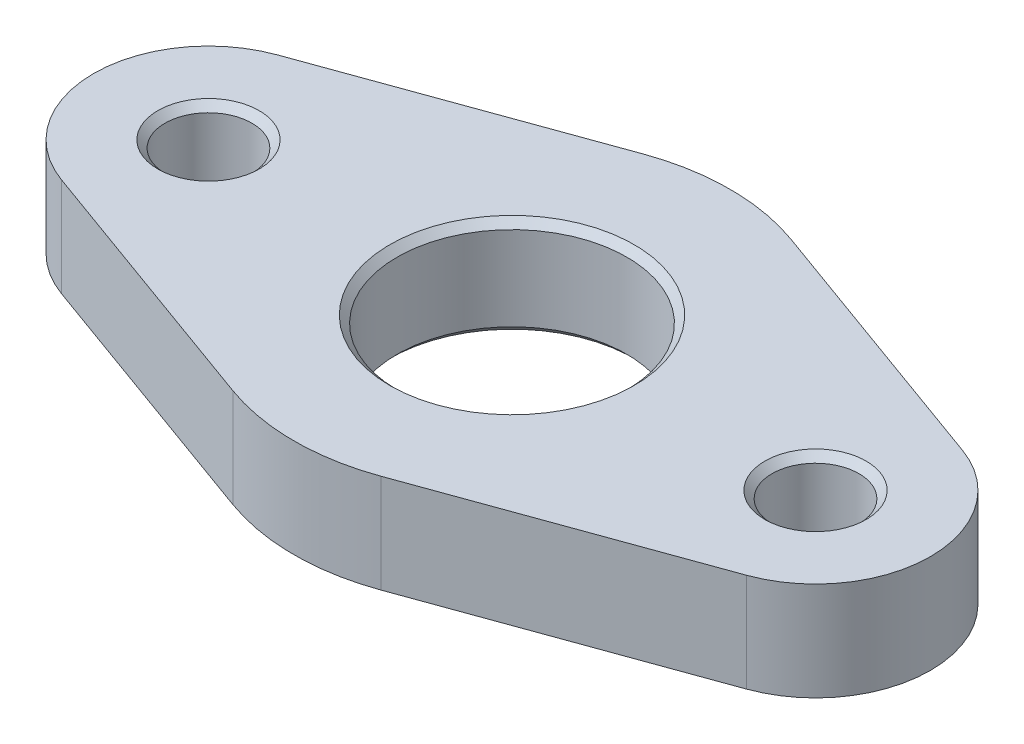
ISO-10303-21;
HEADER;
FILE_DESCRIPTION(('STEP AP214'),'2;1');
FILE_NAME('part.step','',(''),(''),'','','');
FILE_SCHEMA(('AUTOMOTIVE_DESIGN { 1 0 10303 214 1 1 1 1 }'));
ENDSEC;
DATA;
#1=APPLICATION_CONTEXT('core data for automotive mechanical design processes');
#2=APPLICATION_PROTOCOL_DEFINITION('international standard','automotive_design',2000,#1);
#3=PRODUCT_CONTEXT('',#1,'mechanical');
#4=PRODUCT('Part','Part','',(#3));
#5=PRODUCT_RELATED_PRODUCT_CATEGORY('part','',(#4));
#6=PRODUCT_DEFINITION_FORMATION('','',#4);
#7=PRODUCT_DEFINITION_CONTEXT('part definition',#1,'design');
#8=PRODUCT_DEFINITION('design','',#6,#7);
#9=PRODUCT_DEFINITION_SHAPE('','',#8);
#10=(LENGTH_UNIT() NAMED_UNIT(*) SI_UNIT(.MILLI.,.METRE.));
#11=(NAMED_UNIT(*) PLANE_ANGLE_UNIT() SI_UNIT($,.RADIAN.));
#12=(NAMED_UNIT(*) SI_UNIT($,.STERADIAN.) SOLID_ANGLE_UNIT());
#13=UNCERTAINTY_MEASURE_WITH_UNIT(LENGTH_MEASURE(1.E-05),#10,'distance_accuracy_value','');
#14=(GEOMETRIC_REPRESENTATION_CONTEXT(3) GLOBAL_UNCERTAINTY_ASSIGNED_CONTEXT((#13)) GLOBAL_UNIT_ASSIGNED_CONTEXT((#10,
#11,#12)) REPRESENTATION_CONTEXT('',''));
#15=CARTESIAN_POINT('',(0.,0.,0.));
#16=DIRECTION('',(0.,0.,1.));
#17=DIRECTION('',(1.,0.,0.));
#18=AXIS2_PLACEMENT_3D('',#15,#16,#17);
#19=CARTESIAN_POINT('',(-33.55,10.9,0.));
#20=DIRECTION('',(0.,-1.,0.));
#21=DIRECTION('',(0.,0.,-1.));
#22=AXIS2_PLACEMENT_3D('',#19,#20,#21);
#23=CYLINDRICAL_SURFACE('',#22,12.7);
#24=CARTESIAN_POINT('',(-33.55,0.,0.));
#25=DIRECTION('',(0.,1.,0.));
#26=DIRECTION('',(0.,0.,1.));
#27=AXIS2_PLACEMENT_3D('',#24,#25,#26);
#28=CIRCLE('',#27,12.7);
#29=CARTESIAN_POINT('',(-37.8653502235469,0.,-11.9443606965017));
#30=VERTEX_POINT('',#29);
#31=CARTESIAN_POINT('',(-37.8653502235469,0.,11.9443606965017));
#32=VERTEX_POINT('',#31);
#33=EDGE_CURVE('E153',#30,#32,#28,.T.);
#34=ORIENTED_EDGE('',*,*,#33,.T.);
#35=DIRECTION('',(0.,-1.,0.));
#36=VECTOR('',#35,1.);
#37=CARTESIAN_POINT('',(-37.8653502235469,10.9,11.9443606965017));
#38=LINE('',#37,#36);
#39=CARTESIAN_POINT('',(-37.8653502235469,10.9,11.9443606965017));
#40=VERTEX_POINT('',#39);
#41=EDGE_CURVE('E194',#40,#32,#38,.T.);
#42=ORIENTED_EDGE('',*,*,#41,.F.);
#43=CARTESIAN_POINT('',(-33.55,10.9,0.));
#44=DIRECTION('',(0.,1.,0.));
#45=DIRECTION('',(0.,0.,1.));
#46=AXIS2_PLACEMENT_3D('',#43,#44,#45);
#47=CIRCLE('',#46,12.7);
#48=CARTESIAN_POINT('',(-37.8653502235469,10.9,-11.9443606965017));
#49=VERTEX_POINT('',#48);
#50=EDGE_CURVE('E175',#49,#40,#47,.T.);
#51=ORIENTED_EDGE('',*,*,#50,.F.);
#52=DIRECTION('',(0.,-1.,0.));
#53=VECTOR('',#52,1.);
#54=CARTESIAN_POINT('',(-37.8653502235469,10.9,-11.9443606965017));
#55=LINE('',#54,#53);
#56=EDGE_CURVE('E149',#49,#30,#55,.T.);
#57=ORIENTED_EDGE('',*,*,#56,.T.);
#58=EDGE_LOOP('',(#34,#42,#51,#57));
#59=FACE_BOUND('',#58,.T.);
#60=ADVANCED_FACE('F49',(#59),#23,.T.);
#61=CARTESIAN_POINT('',(-37.8653502235469,10.9,11.9443606965017));
#62=DIRECTION('',(0.339791356184799,0.,-0.940500842244224));
#63=DIRECTION('',(-0.940500842244224,0.,-0.339791356184799));
#64=AXIS2_PLACEMENT_3D('',#61,#62,#63);
#65=PLANE('',#64);
#66=DIRECTION('',(0.940500842244224,0.,0.339791356184799));
#67=VECTOR('',#66,1.);
#68=CARTESIAN_POINT('',(-37.8653502235469,0.,11.9443606965017));
#69=LINE('',#68,#67);
#70=CARTESIAN_POINT('',(-8.18897168405365,0.,22.6660702980858));
#71=VERTEX_POINT('',#70);
#72=EDGE_CURVE('E157',#32,#71,#69,.T.);
#73=ORIENTED_EDGE('',*,*,#72,.T.);
#74=DIRECTION('',(0.,-1.,0.));
#75=VECTOR('',#74,1.);
#76=CARTESIAN_POINT('',(-8.18897168405365,10.9,22.6660702980858));
#77=LINE('',#76,#75);
#78=CARTESIAN_POINT('',(-8.18897168405365,10.9,22.6660702980858));
#79=VERTEX_POINT('',#78);
#80=EDGE_CURVE('E190',#79,#71,#77,.T.);
#81=ORIENTED_EDGE('',*,*,#80,.F.);
#82=DIRECTION('',(0.940500842244224,0.,0.339791356184799));
#83=VECTOR('',#82,1.);
#84=CARTESIAN_POINT('',(-37.8653502235469,10.9,11.9443606965017));
#85=LINE('',#84,#83);
#86=EDGE_CURVE('E112',#40,#79,#85,.T.);
#87=ORIENTED_EDGE('',*,*,#86,.F.);
#88=ORIENTED_EDGE('',*,*,#41,.T.);
#89=EDGE_LOOP('',(#73,#81,#87,#88));
#90=FACE_BOUND('',#89,.T.);
#91=ADVANCED_FACE('F272',(#90),#65,.F.);
#92=CARTESIAN_POINT('',(0.,10.9,0.));
#93=DIRECTION('',(0.,-1.,0.));
#94=DIRECTION('',(0.,0.,-1.));
#95=AXIS2_PLACEMENT_3D('',#92,#93,#94);
#96=CYLINDRICAL_SURFACE('',#95,24.1);
#97=CARTESIAN_POINT('',(0.,0.,0.));
#98=DIRECTION('',(0.,1.,0.));
#99=DIRECTION('',(0.,0.,1.));
#100=AXIS2_PLACEMENT_3D('',#97,#98,#99);
#101=CIRCLE('',#100,24.1);
#102=CARTESIAN_POINT('',(8.18897168405365,0.,22.6660702980858));
#103=VERTEX_POINT('',#102);
#104=EDGE_CURVE('E160',#71,#103,#101,.T.);
#105=ORIENTED_EDGE('',*,*,#104,.T.);
#106=DIRECTION('',(0.,-1.,0.));
#107=VECTOR('',#106,1.);
#108=CARTESIAN_POINT('',(8.18897168405365,10.9,22.6660702980858));
#109=LINE('',#108,#107);
#110=CARTESIAN_POINT('',(8.18897168405365,10.9,22.6660702980858));
#111=VERTEX_POINT('',#110);
#112=EDGE_CURVE('E186',#111,#103,#109,.T.);
#113=ORIENTED_EDGE('',*,*,#112,.F.);
#114=CARTESIAN_POINT('',(0.,10.9,0.));
#115=DIRECTION('',(0.,1.,0.));
#116=DIRECTION('',(0.,0.,1.));
#117=AXIS2_PLACEMENT_3D('',#114,#115,#116);
#118=CIRCLE('',#117,24.1);
#119=EDGE_CURVE('E466',#79,#111,#118,.T.);
#120=ORIENTED_EDGE('',*,*,#119,.F.);
#121=ORIENTED_EDGE('',*,*,#80,.T.);
#122=EDGE_LOOP('',(#105,#113,#120,#121));
#123=FACE_BOUND('',#122,.T.);
#124=ADVANCED_FACE('F277',(#123),#96,.T.);
#125=CARTESIAN_POINT('',(37.8653502235469,10.9,11.9443606965017));
#126=DIRECTION('',(-0.339791356184799,0.,-0.940500842244224));
#127=DIRECTION('',(-0.940500842244224,0.,0.339791356184799));
#128=AXIS2_PLACEMENT_3D('',#125,#126,#127);
#129=PLANE('',#128);
#130=DIRECTION('',(0.940500842244224,0.,-0.339791356184799));
#131=VECTOR('',#130,1.);
#132=CARTESIAN_POINT('',(37.8653502235469,0.,11.9443606965017));
#133=LINE('',#132,#131);
#134=CARTESIAN_POINT('',(37.8653502235469,0.,11.9443606965016));
#135=VERTEX_POINT('',#134);
#136=EDGE_CURVE('E163',#103,#135,#133,.T.);
#137=ORIENTED_EDGE('',*,*,#136,.T.);
#138=DIRECTION('',(0.,-1.,0.));
#139=VECTOR('',#138,1.);
#140=CARTESIAN_POINT('',(37.8653502235469,10.9,11.9443606965016));
#141=LINE('',#140,#139);
#142=CARTESIAN_POINT('',(37.8653502235469,10.9,11.9443606965016));
#143=VERTEX_POINT('',#142);
#144=EDGE_CURVE('E182',#143,#135,#141,.T.);
#145=ORIENTED_EDGE('',*,*,#144,.F.);
#146=DIRECTION('',(0.940500842244224,0.,-0.339791356184799));
#147=VECTOR('',#146,1.);
#148=CARTESIAN_POINT('',(37.8653502235469,10.9,11.9443606965017));
#149=LINE('',#148,#147);
#150=EDGE_CURVE('E462',#111,#143,#149,.T.);
#151=ORIENTED_EDGE('',*,*,#150,.F.);
#152=ORIENTED_EDGE('',*,*,#112,.T.);
#153=EDGE_LOOP('',(#137,#145,#151,#152));
#154=FACE_BOUND('',#153,.T.);
#155=ADVANCED_FACE('F426',(#154),#129,.F.);
#156=CARTESIAN_POINT('',(33.55,10.9,0.));
#157=DIRECTION('',(0.,-1.,0.));
#158=DIRECTION('',(0.,0.,-1.));
#159=AXIS2_PLACEMENT_3D('',#156,#157,#158);
#160=CYLINDRICAL_SURFACE('',#159,12.7);
#161=CARTESIAN_POINT('',(33.55,0.,0.));
#162=DIRECTION('',(0.,1.,0.));
#163=DIRECTION('',(0.,0.,-1.));
#164=AXIS2_PLACEMENT_3D('',#161,#162,#163);
#165=CIRCLE('',#164,12.7);
#166=CARTESIAN_POINT('',(37.8653502235469,0.,-11.9443606965017));
#167=VERTEX_POINT('',#166);
#168=EDGE_CURVE('E166',#135,#167,#165,.T.);
#169=ORIENTED_EDGE('',*,*,#168,.T.);
#170=DIRECTION('',(0.,-1.,0.));
#171=VECTOR('',#170,1.);
#172=CARTESIAN_POINT('',(37.8653502235469,10.9,-11.9443606965017));
#173=LINE('',#172,#171);
#174=CARTESIAN_POINT('',(37.8653502235469,10.9,-11.9443606965017));
#175=VERTEX_POINT('',#174);
#176=EDGE_CURVE('E142',#175,#167,#173,.T.);
#177=ORIENTED_EDGE('',*,*,#176,.F.);
#178=CARTESIAN_POINT('',(33.55,10.9,0.));
#179=DIRECTION('',(0.,1.,0.));
#180=DIRECTION('',(0.,0.,-1.));
#181=AXIS2_PLACEMENT_3D('',#178,#179,#180);
#182=CIRCLE('',#181,12.7);
#183=EDGE_CURVE('E131',#143,#175,#182,.T.);
#184=ORIENTED_EDGE('',*,*,#183,.F.);
#185=ORIENTED_EDGE('',*,*,#144,.T.);
#186=EDGE_LOOP('',(#169,#177,#184,#185));
#187=FACE_BOUND('',#186,.T.);
#188=ADVANCED_FACE('F417',(#187),#160,.T.);
#189=CARTESIAN_POINT('',(37.8653502235469,10.9,-11.9443606965017));
#190=DIRECTION('',(-0.339791356184799,0.,0.940500842244224));
#191=DIRECTION('',(0.940500842244224,0.,0.339791356184799));
#192=AXIS2_PLACEMENT_3D('',#189,#190,#191);
#193=PLANE('',#192);
#194=DIRECTION('',(-0.940500842244224,0.,-0.339791356184799));
#195=VECTOR('',#194,1.);
#196=CARTESIAN_POINT('',(37.8653502235469,0.,-11.9443606965017));
#197=LINE('',#196,#195);
#198=CARTESIAN_POINT('',(8.18897168405365,0.,-22.6660702980858));
#199=VERTEX_POINT('',#198);
#200=EDGE_CURVE('E140',#167,#199,#197,.T.);
#201=ORIENTED_EDGE('',*,*,#200,.T.);
#202=DIRECTION('',(0.,-1.,0.));
#203=VECTOR('',#202,1.);
#204=CARTESIAN_POINT('',(8.18897168405365,10.9,-22.6660702980858));
#205=LINE('',#204,#203);
#206=CARTESIAN_POINT('',(8.18897168405365,10.9,-22.6660702980858));
#207=VERTEX_POINT('',#206);
#208=EDGE_CURVE('E137',#207,#199,#205,.T.);
#209=ORIENTED_EDGE('',*,*,#208,.F.);
#210=DIRECTION('',(-0.940500842244224,0.,-0.339791356184799));
#211=VECTOR('',#210,1.);
#212=CARTESIAN_POINT('',(37.8653502235469,10.9,-11.9443606965017));
#213=LINE('',#212,#211);
#214=EDGE_CURVE('E125',#175,#207,#213,.T.);
#215=ORIENTED_EDGE('',*,*,#214,.F.);
#216=ORIENTED_EDGE('',*,*,#176,.T.);
#217=EDGE_LOOP('',(#201,#209,#215,#216));
#218=FACE_BOUND('',#217,.T.);
#219=ADVANCED_FACE('F138',(#218),#193,.F.);
#220=CARTESIAN_POINT('',(0.,10.9,0.));
#221=DIRECTION('',(0.,-1.,0.));
#222=DIRECTION('',(0.,0.,-1.));
#223=AXIS2_PLACEMENT_3D('',#220,#221,#222);
#224=CYLINDRICAL_SURFACE('',#223,24.1);
#225=CARTESIAN_POINT('',(0.,0.,0.));
#226=DIRECTION('',(0.,1.,0.));
#227=DIRECTION('',(0.,0.,1.));
#228=AXIS2_PLACEMENT_3D('',#225,#226,#227);
#229=CIRCLE('',#228,24.1);
#230=CARTESIAN_POINT('',(-8.18897168405366,0.,-22.6660702980858));
#231=VERTEX_POINT('',#230);
#232=EDGE_CURVE('E97',#199,#231,#229,.T.);
#233=ORIENTED_EDGE('',*,*,#232,.T.);
#234=DIRECTION('',(0.,-1.,0.));
#235=VECTOR('',#234,1.);
#236=CARTESIAN_POINT('',(-8.18897168405366,10.9,-22.6660702980858));
#237=LINE('',#236,#235);
#238=CARTESIAN_POINT('',(-8.18897168405366,10.9,-22.6660702980858));
#239=VERTEX_POINT('',#238);
#240=EDGE_CURVE('E143',#239,#231,#237,.T.);
#241=ORIENTED_EDGE('',*,*,#240,.F.);
#242=CARTESIAN_POINT('',(0.,10.9,0.));
#243=DIRECTION('',(0.,1.,0.));
#244=DIRECTION('',(0.,0.,1.));
#245=AXIS2_PLACEMENT_3D('',#242,#243,#244);
#246=CIRCLE('',#245,24.1);
#247=EDGE_CURVE('E129',#207,#239,#246,.T.);
#248=ORIENTED_EDGE('',*,*,#247,.F.);
#249=ORIENTED_EDGE('',*,*,#208,.T.);
#250=EDGE_LOOP('',(#233,#241,#248,#249));
#251=FACE_BOUND('',#250,.T.);
#252=ADVANCED_FACE('F145',(#251),#224,.T.);
#253=CARTESIAN_POINT('',(-37.8653502235469,10.9,-11.9443606965017));
#254=DIRECTION('',(0.339791356184799,0.,0.940500842244224));
#255=DIRECTION('',(0.940500842244224,0.,-0.339791356184799));
#256=AXIS2_PLACEMENT_3D('',#253,#254,#255);
#257=PLANE('',#256);
#258=DIRECTION('',(-0.940500842244224,0.,0.339791356184799));
#259=VECTOR('',#258,1.);
#260=CARTESIAN_POINT('',(-37.8653502235469,0.,-11.9443606965017));
#261=LINE('',#260,#259);
#262=EDGE_CURVE('E103',#231,#30,#261,.T.);
#263=ORIENTED_EDGE('',*,*,#262,.T.);
#264=ORIENTED_EDGE('',*,*,#56,.F.);
#265=DIRECTION('',(-0.940500842244224,0.,0.339791356184799));
#266=VECTOR('',#265,1.);
#267=CARTESIAN_POINT('',(-37.8653502235469,10.9,-11.9443606965017));
#268=LINE('',#267,#266);
#269=EDGE_CURVE('E68',#239,#49,#268,.T.);
#270=ORIENTED_EDGE('',*,*,#269,.F.);
#271=ORIENTED_EDGE('',*,*,#240,.T.);
#272=EDGE_LOOP('',(#263,#264,#270,#271));
#273=FACE_BOUND('',#272,.T.);
#274=ADVANCED_FACE('F261',(#273),#257,.F.);
#275=CARTESIAN_POINT('',(-33.55,10.9,0.));
#276=DIRECTION('',(0.,1.,0.));
#277=DIRECTION('',(0.,0.,1.));
#278=AXIS2_PLACEMENT_3D('',#275,#276,#277);
#279=PLANE('',#278);
#280=CARTESIAN_POINT('',(33.55,10.9,0.));
#281=DIRECTION('',(0.,1.,0.));
#282=DIRECTION('',(0.,0.,1.));
#283=AXIS2_PLACEMENT_3D('',#280,#281,#282);
#284=CIRCLE('',#283,5.59999999999998);
#285=CARTESIAN_POINT('',(33.55,10.9,5.59999999999998));
#286=VERTEX_POINT('',#285);
#287=EDGE_CURVE('E209',#286,#286,#284,.F.);
#288=ORIENTED_EDGE('',*,*,#287,.T.);
#289=EDGE_LOOP('',(#288));
#290=FACE_BOUND('',#289,.T.);
#291=CARTESIAN_POINT('',(0.,10.9,0.));
#292=DIRECTION('',(0.,1.,0.));
#293=DIRECTION('',(0.,0.,1.));
#294=AXIS2_PLACEMENT_3D('',#291,#292,#293);
#295=CIRCLE('',#294,13.5);
#296=CARTESIAN_POINT('',(0.,10.9,13.5));
#297=VERTEX_POINT('',#296);
#298=EDGE_CURVE('E205',#297,#297,#295,.F.);
#299=ORIENTED_EDGE('',*,*,#298,.T.);
#300=EDGE_LOOP('',(#299));
#301=FACE_BOUND('',#300,.T.);
#302=CARTESIAN_POINT('',(-33.55,10.9,0.));
#303=DIRECTION('',(0.,1.,0.));
#304=DIRECTION('',(0.,0.,1.));
#305=AXIS2_PLACEMENT_3D('',#302,#303,#304);
#306=CIRCLE('',#305,5.59999999999998);
#307=CARTESIAN_POINT('',(-33.55,10.9,5.59999999999998));
#308=VERTEX_POINT('',#307);
#309=EDGE_CURVE('E201',#308,#308,#306,.F.);
#310=ORIENTED_EDGE('',*,*,#309,.T.);
#311=EDGE_LOOP('',(#310));
#312=FACE_BOUND('',#311,.T.);
#313=ORIENTED_EDGE('',*,*,#50,.T.);
#314=ORIENTED_EDGE('',*,*,#86,.T.);
#315=ORIENTED_EDGE('',*,*,#119,.T.);
#316=ORIENTED_EDGE('',*,*,#150,.T.);
#317=ORIENTED_EDGE('',*,*,#183,.T.);
#318=ORIENTED_EDGE('',*,*,#214,.T.);
#319=ORIENTED_EDGE('',*,*,#247,.T.);
#320=ORIENTED_EDGE('',*,*,#269,.T.);
#321=EDGE_LOOP('',(#313,#314,#315,#316,#317,#318,#319,#320));
#322=FACE_BOUND('',#321,.T.);
#323=ADVANCED_FACE('F127',(#290,#301,#312,#322),#279,.T.);
#324=CARTESIAN_POINT('',(-33.55,0.,0.));
#325=DIRECTION('',(0.,1.,0.));
#326=DIRECTION('',(0.,0.,1.));
#327=AXIS2_PLACEMENT_3D('',#324,#325,#326);
#328=PLANE('',#327);
#329=CARTESIAN_POINT('',(33.55,0.,0.));
#330=DIRECTION('',(0.,1.,0.));
#331=DIRECTION('',(0.,0.,1.));
#332=AXIS2_PLACEMENT_3D('',#329,#330,#331);
#333=CIRCLE('',#332,5.59999999999999);
#334=CARTESIAN_POINT('',(33.55,0.,5.59999999999999));
#335=VERTEX_POINT('',#334);
#336=EDGE_CURVE('E229',#335,#335,#333,.T.);
#337=ORIENTED_EDGE('',*,*,#336,.T.);
#338=EDGE_LOOP('',(#337));
#339=FACE_BOUND('',#338,.T.);
#340=CARTESIAN_POINT('',(0.,0.,0.));
#341=DIRECTION('',(0.,1.,0.));
#342=DIRECTION('',(0.,0.,1.));
#343=AXIS2_PLACEMENT_3D('',#340,#341,#342);
#344=CIRCLE('',#343,13.5);
#345=CARTESIAN_POINT('',(0.,0.,13.5));
#346=VERTEX_POINT('',#345);
#347=EDGE_CURVE('E225',#346,#346,#344,.T.);
#348=ORIENTED_EDGE('',*,*,#347,.T.);
#349=EDGE_LOOP('',(#348));
#350=FACE_BOUND('',#349,.T.);
#351=CARTESIAN_POINT('',(-33.55,0.,0.));
#352=DIRECTION('',(0.,1.,0.));
#353=DIRECTION('',(0.,0.,1.));
#354=AXIS2_PLACEMENT_3D('',#351,#352,#353);
#355=CIRCLE('',#354,5.59999999999999);
#356=CARTESIAN_POINT('',(-33.55,0.,5.59999999999999));
#357=VERTEX_POINT('',#356);
#358=EDGE_CURVE('E221',#357,#357,#355,.T.);
#359=ORIENTED_EDGE('',*,*,#358,.T.);
#360=EDGE_LOOP('',(#359));
#361=FACE_BOUND('',#360,.T.);
#362=ORIENTED_EDGE('',*,*,#33,.F.);
#363=ORIENTED_EDGE('',*,*,#262,.F.);
#364=ORIENTED_EDGE('',*,*,#232,.F.);
#365=ORIENTED_EDGE('',*,*,#200,.F.);
#366=ORIENTED_EDGE('',*,*,#168,.F.);
#367=ORIENTED_EDGE('',*,*,#136,.F.);
#368=ORIENTED_EDGE('',*,*,#104,.F.);
#369=ORIENTED_EDGE('',*,*,#72,.F.);
#370=EDGE_LOOP('',(#362,#363,#364,#365,#366,#367,#368,#369));
#371=FACE_BOUND('',#370,.T.);
#372=ADVANCED_FACE('F249',(#339,#350,#361,#371),#328,.F.);
#373=CARTESIAN_POINT('',(0.,0.,0.));
#374=DIRECTION('',(0.,1.,0.));
#375=DIRECTION('',(0.,0.,1.));
#376=AXIS2_PLACEMENT_3D('',#373,#374,#375);
#377=CYLINDRICAL_SURFACE('',#376,12.7);
#378=CARTESIAN_POINT('',(0.,0.79999999999998,0.));
#379=DIRECTION('',(0.,1.,0.));
#380=DIRECTION('',(0.,0.,1.));
#381=AXIS2_PLACEMENT_3D('',#378,#379,#380);
#382=CIRCLE('',#381,12.7);
#383=CARTESIAN_POINT('',(0.,0.79999999999998,12.7));
#384=VERTEX_POINT('',#383);
#385=EDGE_CURVE('E60',#384,#384,#382,.F.);
#386=ORIENTED_EDGE('',*,*,#385,.T.);
#387=EDGE_LOOP('',(#386));
#388=FACE_BOUND('',#387,.T.);
#389=CARTESIAN_POINT('',(0.,10.1,0.));
#390=DIRECTION('',(0.,1.,0.));
#391=DIRECTION('',(0.,0.,1.));
#392=AXIS2_PLACEMENT_3D('',#389,#390,#391);
#393=CIRCLE('',#392,12.7);
#394=CARTESIAN_POINT('',(0.,10.1,12.7));
#395=VERTEX_POINT('',#394);
#396=EDGE_CURVE('E213',#395,#395,#393,.T.);
#397=ORIENTED_EDGE('',*,*,#396,.T.);
#398=EDGE_LOOP('',(#397));
#399=FACE_BOUND('',#398,.T.);
#400=ADVANCED_FACE('F240',(#388,#399),#377,.F.);
#401=CARTESIAN_POINT('',(-33.55,0.,0.));
#402=DIRECTION('',(0.,1.,0.));
#403=DIRECTION('',(0.,0.,1.));
#404=AXIS2_PLACEMENT_3D('',#401,#402,#403);
#405=CYLINDRICAL_SURFACE('',#404,4.8);
#406=CARTESIAN_POINT('',(-33.55,0.800000000000008,0.));
#407=DIRECTION('',(0.,1.,0.));
#408=DIRECTION('',(0.,0.,1.));
#409=AXIS2_PLACEMENT_3D('',#406,#407,#408);
#410=CIRCLE('',#409,4.8);
#411=CARTESIAN_POINT('',(-33.55,0.800000000000008,4.8));
#412=VERTEX_POINT('',#411);
#413=EDGE_CURVE('E11',#412,#412,#410,.F.);
#414=ORIENTED_EDGE('',*,*,#413,.T.);
#415=EDGE_LOOP('',(#414));
#416=FACE_BOUND('',#415,.T.);
#417=CARTESIAN_POINT('',(-33.55,10.1,0.));
#418=DIRECTION('',(0.,1.,0.));
#419=DIRECTION('',(0.,0.,1.));
#420=AXIS2_PLACEMENT_3D('',#417,#418,#419);
#421=CIRCLE('',#420,4.8);
#422=CARTESIAN_POINT('',(-33.55,10.1,4.8));
#423=VERTEX_POINT('',#422);
#424=EDGE_CURVE('E217',#423,#423,#421,.T.);
#425=ORIENTED_EDGE('',*,*,#424,.T.);
#426=EDGE_LOOP('',(#425));
#427=FACE_BOUND('',#426,.T.);
#428=ADVANCED_FACE('F321',(#416,#427),#405,.F.);
#429=CARTESIAN_POINT('',(33.55,0.,0.));
#430=DIRECTION('',(0.,1.,0.));
#431=DIRECTION('',(0.,0.,1.));
#432=AXIS2_PLACEMENT_3D('',#429,#430,#431);
#433=CYLINDRICAL_SURFACE('',#432,4.8);
#434=CARTESIAN_POINT('',(33.55,0.800000000000008,0.));
#435=DIRECTION('',(0.,1.,0.));
#436=DIRECTION('',(0.,0.,1.));
#437=AXIS2_PLACEMENT_3D('',#434,#435,#436);
#438=CIRCLE('',#437,4.8);
#439=CARTESIAN_POINT('',(33.55,0.800000000000008,4.79999999999999));
#440=VERTEX_POINT('',#439);
#441=EDGE_CURVE('E233',#440,#440,#438,.F.);
#442=ORIENTED_EDGE('',*,*,#441,.T.);
#443=EDGE_LOOP('',(#442));
#444=FACE_BOUND('',#443,.T.);
#445=CARTESIAN_POINT('',(33.55,10.1,0.));
#446=DIRECTION('',(0.,1.,0.));
#447=DIRECTION('',(0.,0.,1.));
#448=AXIS2_PLACEMENT_3D('',#445,#446,#447);
#449=CIRCLE('',#448,4.8);
#450=CARTESIAN_POINT('',(33.55,10.1,4.79999999999999));
#451=VERTEX_POINT('',#450);
#452=EDGE_CURVE('E197',#451,#451,#449,.T.);
#453=ORIENTED_EDGE('',*,*,#452,.T.);
#454=EDGE_LOOP('',(#453));
#455=FACE_BOUND('',#454,.T.);
#456=ADVANCED_FACE('F289',(#444,#455),#433,.F.);
#457=CARTESIAN_POINT('',(33.55,10.1,0.));
#458=DIRECTION('',(0.,1.,0.));
#459=DIRECTION('',(0.,0.,1.));
#460=AXIS2_PLACEMENT_3D('',#457,#458,#459);
#461=CONICAL_SURFACE('',#460,4.8,0.785398163397458);
#462=ORIENTED_EDGE('',*,*,#287,.F.);
#463=EDGE_LOOP('',(#462));
#464=FACE_BOUND('',#463,.T.);
#465=ORIENTED_EDGE('',*,*,#452,.F.);
#466=EDGE_LOOP('',(#465));
#467=FACE_BOUND('',#466,.T.);
#468=ADVANCED_FACE('F282',(#464,#467),#461,.F.);
#469=CARTESIAN_POINT('',(0.,10.1,0.));
#470=DIRECTION('',(0.,1.,0.));
#471=DIRECTION('',(0.,0.,1.));
#472=AXIS2_PLACEMENT_3D('',#469,#470,#471);
#473=CONICAL_SURFACE('',#472,12.7,0.785398163397449);
#474=ORIENTED_EDGE('',*,*,#298,.F.);
#475=EDGE_LOOP('',(#474));
#476=FACE_BOUND('',#475,.T.);
#477=ORIENTED_EDGE('',*,*,#396,.F.);
#478=EDGE_LOOP('',(#477));
#479=FACE_BOUND('',#478,.T.);
#480=ADVANCED_FACE('F288',(#476,#479),#473,.F.);
#481=CARTESIAN_POINT('',(-33.55,10.1,0.));
#482=DIRECTION('',(0.,1.,0.));
#483=DIRECTION('',(0.,0.,1.));
#484=AXIS2_PLACEMENT_3D('',#481,#482,#483);
#485=CONICAL_SURFACE('',#484,4.8,0.785398163397458);
#486=ORIENTED_EDGE('',*,*,#309,.F.);
#487=EDGE_LOOP('',(#486));
#488=FACE_BOUND('',#487,.T.);
#489=ORIENTED_EDGE('',*,*,#424,.F.);
#490=EDGE_LOOP('',(#489));
#491=FACE_BOUND('',#490,.T.);
#492=ADVANCED_FACE('F296',(#488,#491),#485,.F.);
#493=CARTESIAN_POINT('',(33.55,0.,0.));
#494=DIRECTION('',(0.,-1.,0.));
#495=DIRECTION('',(0.,0.,-1.));
#496=AXIS2_PLACEMENT_3D('',#493,#494,#495);
#497=CONICAL_SURFACE('',#496,5.59999999999999,0.785398163397441);
#498=ORIENTED_EDGE('',*,*,#441,.F.);
#499=EDGE_LOOP('',(#498));
#500=FACE_BOUND('',#499,.T.);
#501=ORIENTED_EDGE('',*,*,#336,.F.);
#502=EDGE_LOOP('',(#501));
#503=FACE_BOUND('',#502,.T.);
#504=ADVANCED_FACE('F246',(#500,#503),#497,.F.);
#505=CARTESIAN_POINT('',(0.,0.,0.));
#506=DIRECTION('',(0.,-1.,0.));
#507=DIRECTION('',(0.,0.,-1.));
#508=AXIS2_PLACEMENT_3D('',#505,#506,#507);
#509=CONICAL_SURFACE('',#508,13.5,0.785398163397443);
#510=ORIENTED_EDGE('',*,*,#385,.F.);
#511=EDGE_LOOP('',(#510));
#512=FACE_BOUND('',#511,.T.);
#513=ORIENTED_EDGE('',*,*,#347,.F.);
#514=EDGE_LOOP('',(#513));
#515=FACE_BOUND('',#514,.T.);
#516=ADVANCED_FACE('F243',(#512,#515),#509,.F.);
#517=CARTESIAN_POINT('',(-33.55,0.,0.));
#518=DIRECTION('',(0.,-1.,0.));
#519=DIRECTION('',(0.,0.,-1.));
#520=AXIS2_PLACEMENT_3D('',#517,#518,#519);
#521=CONICAL_SURFACE('',#520,5.59999999999999,0.785398163397441);
#522=ORIENTED_EDGE('',*,*,#413,.F.);
#523=EDGE_LOOP('',(#522));
#524=FACE_BOUND('',#523,.T.);
#525=ORIENTED_EDGE('',*,*,#358,.F.);
#526=EDGE_LOOP('',(#525));
#527=FACE_BOUND('',#526,.T.);
#528=ADVANCED_FACE('F52',(#524,#527),#521,.F.);
#529=CLOSED_SHELL('',(#60,#91,#124,#155,#188,#219,#252,#274,#323,#372,#400,#428,#456,#468,#480,
#492,#504,#516,#528));
#530=MANIFOLD_SOLID_BREP('B2',#529);
#531=ADVANCED_BREP_SHAPE_REPRESENTATION('',(#18,#530),#14);
#532=SHAPE_DEFINITION_REPRESENTATION(#9,#531);
ENDSEC;
END-ISO-10303-21;
